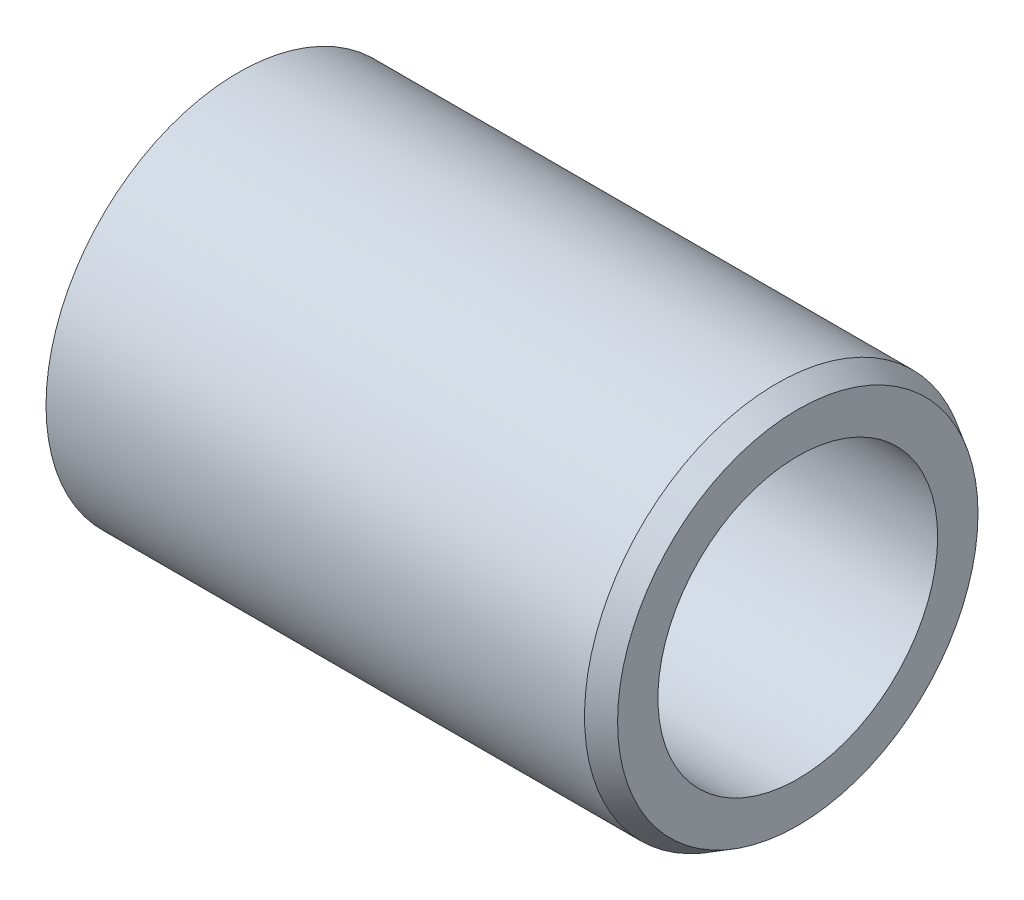
ISO-10303-21;
HEADER;
FILE_DESCRIPTION(('STEP AP214'),'2;1');
FILE_NAME('part.step','',(''),(''),'','','');
FILE_SCHEMA(('AUTOMOTIVE_DESIGN { 1 0 10303 214 1 1 1 1 }'));
ENDSEC;
DATA;
#1=APPLICATION_CONTEXT('core data for automotive mechanical design processes');
#2=APPLICATION_PROTOCOL_DEFINITION('international standard','automotive_design',2000,#1);
#3=PRODUCT_CONTEXT('',#1,'mechanical');
#4=PRODUCT('Part','Part','',(#3));
#5=PRODUCT_RELATED_PRODUCT_CATEGORY('part','',(#4));
#6=PRODUCT_DEFINITION_FORMATION('','',#4);
#7=PRODUCT_DEFINITION_CONTEXT('part definition',#1,'design');
#8=PRODUCT_DEFINITION('design','',#6,#7);
#9=PRODUCT_DEFINITION_SHAPE('','',#8);
#10=(LENGTH_UNIT() NAMED_UNIT(*) SI_UNIT(.MILLI.,.METRE.));
#11=(NAMED_UNIT(*) PLANE_ANGLE_UNIT() SI_UNIT($,.RADIAN.));
#12=(NAMED_UNIT(*) SI_UNIT($,.STERADIAN.) SOLID_ANGLE_UNIT());
#13=UNCERTAINTY_MEASURE_WITH_UNIT(LENGTH_MEASURE(1.E-05),#10,'distance_accuracy_value','');
#14=(GEOMETRIC_REPRESENTATION_CONTEXT(3) GLOBAL_UNCERTAINTY_ASSIGNED_CONTEXT((#13)) GLOBAL_UNIT_ASSIGNED_CONTEXT((#10,
#11,#12)) REPRESENTATION_CONTEXT('',''));
#15=CARTESIAN_POINT('',(0.,0.,0.));
#16=DIRECTION('',(0.,0.,1.));
#17=DIRECTION('',(1.,0.,0.));
#18=AXIS2_PLACEMENT_3D('',#15,#16,#17);
#19=CARTESIAN_POINT('',(4.25,0.,0.));
#20=DIRECTION('',(1.,0.,0.));
#21=DIRECTION('',(0.,0.,-1.));
#22=AXIS2_PLACEMENT_3D('',#19,#20,#21);
#23=CYLINDRICAL_SURFACE('',#22,2.);
#24=CARTESIAN_POINT('',(0.499999999760803,0.,0.));
#25=DIRECTION('',(-1.,0.,0.));
#26=DIRECTION('',(0.,0.,1.));
#27=AXIS2_PLACEMENT_3D('',#24,#25,#26);
#28=CIRCLE('',#27,1.99999999995271);
#29=CARTESIAN_POINT('',(0.499999999760803,0.,1.99999999995271));
#30=VERTEX_POINT('',#29);
#31=EDGE_CURVE('E36',#30,#30,#28,.T.);
#32=ORIENTED_EDGE('',*,*,#31,.T.);
#33=EDGE_LOOP('',(#32));
#34=FACE_BOUND('',#33,.T.);
#35=CARTESIAN_POINT('',(8.,0.,0.));
#36=DIRECTION('',(1.,0.,0.));
#37=DIRECTION('',(0.,0.,-1.));
#38=AXIS2_PLACEMENT_3D('',#35,#36,#37);
#39=CIRCLE('',#38,2.);
#40=CARTESIAN_POINT('',(8.,0.,-2.));
#41=VERTEX_POINT('',#40);
#42=EDGE_CURVE('E17',#41,#41,#39,.F.);
#43=ORIENTED_EDGE('',*,*,#42,.F.);
#44=EDGE_LOOP('',(#43));
#45=FACE_BOUND('',#44,.T.);
#46=ADVANCED_FACE('F14',(#34,#45),#23,.F.);
#47=CARTESIAN_POINT('',(-2.27373675443232E-10,0.,0.));
#48=DIRECTION('',(-1.,0.,0.));
#49=DIRECTION('',(0.,0.,1.));
#50=AXIS2_PLACEMENT_3D('',#47,#48,#49);
#51=CONICAL_SURFACE('',#50,2.28867513453679,0.523598775592442);
#52=ORIENTED_EDGE('',*,*,#31,.F.);
#53=EDGE_LOOP('',(#52));
#54=FACE_BOUND('',#53,.T.);
#55=CARTESIAN_POINT('',(-2.27373675443232E-10,0.,0.));
#56=DIRECTION('',(-1.,0.,0.));
#57=DIRECTION('',(0.,0.,1.));
#58=AXIS2_PLACEMENT_3D('',#55,#56,#57);
#59=CIRCLE('',#58,2.28867513453679);
#60=CARTESIAN_POINT('',(-2.27373675443232E-10,0.,2.28867513453679));
#61=VERTEX_POINT('',#60);
#62=EDGE_CURVE('E41',#61,#61,#59,.F.);
#63=ORIENTED_EDGE('',*,*,#62,.F.);
#64=EDGE_LOOP('',(#63));
#65=FACE_BOUND('',#64,.T.);
#66=ADVANCED_FACE('F53',(#54,#65),#51,.F.);
#67=CARTESIAN_POINT('',(8.,2.,0.));
#68=DIRECTION('',(1.,0.,0.));
#69=DIRECTION('',(0.,0.,-1.));
#70=AXIS2_PLACEMENT_3D('',#67,#68,#69);
#71=PLANE('',#70);
#72=ORIENTED_EDGE('',*,*,#42,.T.);
#73=EDGE_LOOP('',(#72));
#74=FACE_BOUND('',#73,.T.);
#75=CARTESIAN_POINT('',(7.99999999998136,0.,0.));
#76=DIRECTION('',(-1.,0.,0.));
#77=DIRECTION('',(0.,-1.,0.));
#78=AXIS2_PLACEMENT_3D('',#75,#76,#77);
#79=CIRCLE('',#78,2.576794919168);
#80=CARTESIAN_POINT('',(7.99999999998136,-2.576794919168,0.));
#81=VERTEX_POINT('',#80);
#82=EDGE_CURVE('E31',#81,#81,#79,.T.);
#83=ORIENTED_EDGE('',*,*,#82,.F.);
#84=EDGE_LOOP('',(#83));
#85=FACE_BOUND('',#84,.T.);
#86=ADVANCED_FACE('F49',(#74,#85),#71,.T.);
#87=CARTESIAN_POINT('',(0.,2.75,0.));
#88=DIRECTION('',(-1.,0.,0.));
#89=DIRECTION('',(0.,0.,1.));
#90=AXIS2_PLACEMENT_3D('',#87,#88,#89);
#91=PLANE('',#90);
#92=ORIENTED_EDGE('',*,*,#62,.T.);
#93=EDGE_LOOP('',(#92));
#94=FACE_BOUND('',#93,.T.);
#95=CARTESIAN_POINT('',(0.,0.,0.));
#96=DIRECTION('',(1.,0.,0.));
#97=DIRECTION('',(0.,0.,-1.));
#98=AXIS2_PLACEMENT_3D('',#95,#96,#97);
#99=CIRCLE('',#98,2.75);
#100=CARTESIAN_POINT('',(0.,0.,-2.75));
#101=VERTEX_POINT('',#100);
#102=EDGE_CURVE('E22',#101,#101,#99,.T.);
#103=ORIENTED_EDGE('',*,*,#102,.F.);
#104=EDGE_LOOP('',(#103));
#105=FACE_BOUND('',#104,.T.);
#106=ADVANCED_FACE('F67',(#94,#105),#91,.T.);
#107=CARTESIAN_POINT('',(7.70000000017035,0.,0.));
#108=DIRECTION('',(-1.,0.,0.));
#109=DIRECTION('',(0.,-1.,0.));
#110=AXIS2_PLACEMENT_3D('',#107,#108,#109);
#111=CONICAL_SURFACE('',#110,2.74999999987813,0.523598775754179);
#112=ORIENTED_EDGE('',*,*,#82,.T.);
#113=EDGE_LOOP('',(#112));
#114=FACE_BOUND('',#113,.T.);
#115=CARTESIAN_POINT('',(7.7,0.,0.));
#116=DIRECTION('',(1.,0.,0.));
#117=DIRECTION('',(0.,0.,-1.));
#118=AXIS2_PLACEMENT_3D('',#115,#116,#117);
#119=CIRCLE('',#118,2.75);
#120=CARTESIAN_POINT('',(7.7,0.,-2.75));
#121=VERTEX_POINT('',#120);
#122=EDGE_CURVE('E10',#121,#121,#119,.F.);
#123=ORIENTED_EDGE('',*,*,#122,.F.);
#124=EDGE_LOOP('',(#123));
#125=FACE_BOUND('',#124,.T.);
#126=ADVANCED_FACE('F62',(#114,#125),#111,.T.);
#127=CARTESIAN_POINT('',(3.85,0.,0.));
#128=DIRECTION('',(1.,0.,0.));
#129=DIRECTION('',(0.,0.,-1.));
#130=AXIS2_PLACEMENT_3D('',#127,#128,#129);
#131=CYLINDRICAL_SURFACE('',#130,2.75);
#132=ORIENTED_EDGE('',*,*,#122,.T.);
#133=EDGE_LOOP('',(#132));
#134=FACE_BOUND('',#133,.T.);
#135=ORIENTED_EDGE('',*,*,#102,.T.);
#136=EDGE_LOOP('',(#135));
#137=FACE_BOUND('',#136,.T.);
#138=ADVANCED_FACE('F60',(#134,#137),#131,.T.);
#139=CLOSED_SHELL('',(#46,#66,#86,#106,#126,#138));
#140=MANIFOLD_SOLID_BREP('B1',#139);
#141=ADVANCED_BREP_SHAPE_REPRESENTATION('',(#18,#140),#14);
#142=SHAPE_DEFINITION_REPRESENTATION(#9,#141);
ENDSEC;
END-ISO-10303-21;
